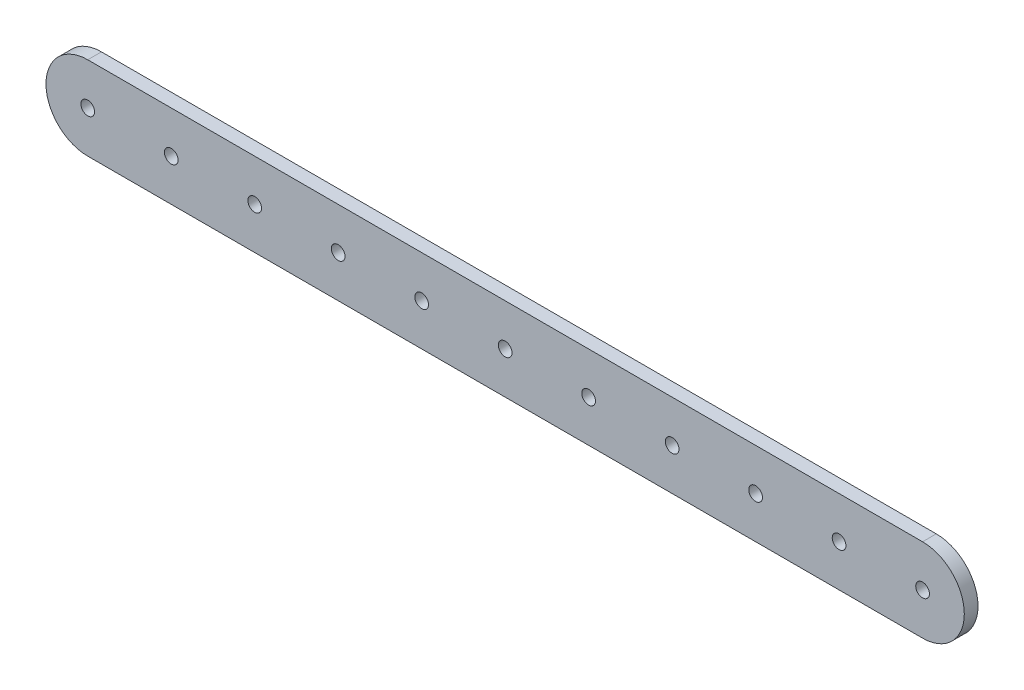
ISO-10303-21;
HEADER;
FILE_DESCRIPTION(('STEP AP214'),'2;1');
FILE_NAME('part.step','',(''),(''),'','','');
FILE_SCHEMA(('AUTOMOTIVE_DESIGN { 1 0 10303 214 1 1 1 1 }'));
ENDSEC;
DATA;
#1=APPLICATION_CONTEXT('core data for automotive mechanical design processes');
#2=APPLICATION_PROTOCOL_DEFINITION('international standard','automotive_design',2000,#1);
#3=PRODUCT_CONTEXT('',#1,'mechanical');
#4=PRODUCT('Part','Part','',(#3));
#5=PRODUCT_RELATED_PRODUCT_CATEGORY('part','',(#4));
#6=PRODUCT_DEFINITION_FORMATION('','',#4);
#7=PRODUCT_DEFINITION_CONTEXT('part definition',#1,'design');
#8=PRODUCT_DEFINITION('design','',#6,#7);
#9=PRODUCT_DEFINITION_SHAPE('','',#8);
#10=(LENGTH_UNIT() NAMED_UNIT(*) SI_UNIT(.MILLI.,.METRE.));
#11=(NAMED_UNIT(*) PLANE_ANGLE_UNIT() SI_UNIT($,.RADIAN.));
#12=(NAMED_UNIT(*) SI_UNIT($,.STERADIAN.) SOLID_ANGLE_UNIT());
#13=UNCERTAINTY_MEASURE_WITH_UNIT(LENGTH_MEASURE(1.E-05),#10,'distance_accuracy_value','');
#14=(GEOMETRIC_REPRESENTATION_CONTEXT(3) GLOBAL_UNCERTAINTY_ASSIGNED_CONTEXT((#13)) GLOBAL_UNIT_ASSIGNED_CONTEXT((#10,
#11,#12)) REPRESENTATION_CONTEXT('',''));
#15=CARTESIAN_POINT('',(0.,0.,0.));
#16=DIRECTION('',(0.,0.,1.));
#17=DIRECTION('',(1.,0.,0.));
#18=AXIS2_PLACEMENT_3D('',#15,#16,#17);
#19=CARTESIAN_POINT('',(-1111.82727272727,0.,-70.7106781186546));
#20=DIRECTION('',(0.,0.,1.));
#21=DIRECTION('',(1.,0.,0.));
#22=AXIS2_PLACEMENT_3D('',#19,#20,#21);
#23=CYLINDRICAL_SURFACE('',#22,25.);
#24=CARTESIAN_POINT('',(-1111.82727272727,0.,0.));
#25=DIRECTION('',(0.,0.,1.));
#26=DIRECTION('',(1.,0.,0.));
#27=AXIS2_PLACEMENT_3D('',#24,#25,#26);
#28=CIRCLE('',#27,25.);
#29=CARTESIAN_POINT('',(-1086.82727272727,0.,0.));
#30=VERTEX_POINT('',#29);
#31=EDGE_CURVE('E50',#30,#30,#28,.F.);
#32=ORIENTED_EDGE('',*,*,#31,.T.);
#33=EDGE_LOOP('',(#32));
#34=FACE_BOUND('',#33,.T.);
#35=CARTESIAN_POINT('',(-1111.82727272727,0.,50.));
#36=DIRECTION('',(0.,0.,1.));
#37=DIRECTION('',(1.,0.,0.));
#38=AXIS2_PLACEMENT_3D('',#35,#36,#37);
#39=CIRCLE('',#38,25.);
#40=CARTESIAN_POINT('',(-1086.82727272727,0.,50.));
#41=VERTEX_POINT('',#40);
#42=EDGE_CURVE('E11',#41,#41,#39,.T.);
#43=ORIENTED_EDGE('',*,*,#42,.T.);
#44=EDGE_LOOP('',(#43));
#45=FACE_BOUND('',#44,.T.);
#46=ADVANCED_FACE('F41',(#34,#45),#23,.F.);
#47=CARTESIAN_POINT('',(-807.027272727272,0.,-70.7106781186546));
#48=DIRECTION('',(0.,0.,1.));
#49=DIRECTION('',(1.,0.,0.));
#50=AXIS2_PLACEMENT_3D('',#47,#48,#49);
#51=CYLINDRICAL_SURFACE('',#50,25.);
#52=CARTESIAN_POINT('',(-807.027272727272,0.,0.));
#53=DIRECTION('',(0.,0.,1.));
#54=DIRECTION('',(1.,0.,0.));
#55=AXIS2_PLACEMENT_3D('',#52,#53,#54);
#56=CIRCLE('',#55,25.);
#57=CARTESIAN_POINT('',(-782.027272727272,0.,0.));
#58=VERTEX_POINT('',#57);
#59=EDGE_CURVE('E179',#58,#58,#56,.F.);
#60=ORIENTED_EDGE('',*,*,#59,.T.);
#61=EDGE_LOOP('',(#60));
#62=FACE_BOUND('',#61,.T.);
#63=CARTESIAN_POINT('',(-807.027272727272,0.,50.));
#64=DIRECTION('',(0.,0.,1.));
#65=DIRECTION('',(1.,0.,0.));
#66=AXIS2_PLACEMENT_3D('',#63,#64,#65);
#67=CIRCLE('',#66,25.);
#68=CARTESIAN_POINT('',(-782.027272727272,0.,50.));
#69=VERTEX_POINT('',#68);
#70=EDGE_CURVE('E183',#69,#69,#67,.T.);
#71=ORIENTED_EDGE('',*,*,#70,.T.);
#72=EDGE_LOOP('',(#71));
#73=FACE_BOUND('',#72,.T.);
#74=ADVANCED_FACE('F211',(#62,#73),#51,.F.);
#75=CARTESIAN_POINT('',(-502.227272727272,0.,-70.7106781186546));
#76=DIRECTION('',(0.,0.,1.));
#77=DIRECTION('',(1.,0.,0.));
#78=AXIS2_PLACEMENT_3D('',#75,#76,#77);
#79=CYLINDRICAL_SURFACE('',#78,25.);
#80=CARTESIAN_POINT('',(-502.227272727272,0.,0.));
#81=DIRECTION('',(0.,0.,1.));
#82=DIRECTION('',(1.,0.,0.));
#83=AXIS2_PLACEMENT_3D('',#80,#81,#82);
#84=CIRCLE('',#83,25.);
#85=CARTESIAN_POINT('',(-477.227272727272,0.,0.));
#86=VERTEX_POINT('',#85);
#87=EDGE_CURVE('E171',#86,#86,#84,.F.);
#88=ORIENTED_EDGE('',*,*,#87,.T.);
#89=EDGE_LOOP('',(#88));
#90=FACE_BOUND('',#89,.T.);
#91=CARTESIAN_POINT('',(-502.227272727272,0.,50.));
#92=DIRECTION('',(0.,0.,1.));
#93=DIRECTION('',(1.,0.,0.));
#94=AXIS2_PLACEMENT_3D('',#91,#92,#93);
#95=CIRCLE('',#94,25.);
#96=CARTESIAN_POINT('',(-477.227272727272,0.,50.));
#97=VERTEX_POINT('',#96);
#98=EDGE_CURVE('E175',#97,#97,#95,.T.);
#99=ORIENTED_EDGE('',*,*,#98,.T.);
#100=EDGE_LOOP('',(#99));
#101=FACE_BOUND('',#100,.T.);
#102=ADVANCED_FACE('F215',(#90,#101),#79,.F.);
#103=CARTESIAN_POINT('',(-197.427272727272,0.,-70.7106781186546));
#104=DIRECTION('',(0.,0.,1.));
#105=DIRECTION('',(1.,0.,0.));
#106=AXIS2_PLACEMENT_3D('',#103,#104,#105);
#107=CYLINDRICAL_SURFACE('',#106,25.);
#108=CARTESIAN_POINT('',(-197.427272727272,0.,0.));
#109=DIRECTION('',(0.,0.,1.));
#110=DIRECTION('',(1.,0.,0.));
#111=AXIS2_PLACEMENT_3D('',#108,#109,#110);
#112=CIRCLE('',#111,25.);
#113=CARTESIAN_POINT('',(-172.427272727272,0.,0.));
#114=VERTEX_POINT('',#113);
#115=EDGE_CURVE('E163',#114,#114,#112,.F.);
#116=ORIENTED_EDGE('',*,*,#115,.T.);
#117=EDGE_LOOP('',(#116));
#118=FACE_BOUND('',#117,.T.);
#119=CARTESIAN_POINT('',(-197.427272727272,0.,50.));
#120=DIRECTION('',(0.,0.,1.));
#121=DIRECTION('',(1.,0.,0.));
#122=AXIS2_PLACEMENT_3D('',#119,#120,#121);
#123=CIRCLE('',#122,25.);
#124=CARTESIAN_POINT('',(-172.427272727272,0.,50.));
#125=VERTEX_POINT('',#124);
#126=EDGE_CURVE('E167',#125,#125,#123,.T.);
#127=ORIENTED_EDGE('',*,*,#126,.T.);
#128=EDGE_LOOP('',(#127));
#129=FACE_BOUND('',#128,.T.);
#130=ADVANCED_FACE('F220',(#118,#129),#107,.F.);
#131=CARTESIAN_POINT('',(107.372727272728,0.,-70.7106781186546));
#132=DIRECTION('',(0.,0.,1.));
#133=DIRECTION('',(1.,0.,0.));
#134=AXIS2_PLACEMENT_3D('',#131,#132,#133);
#135=CYLINDRICAL_SURFACE('',#134,25.);
#136=CARTESIAN_POINT('',(107.372727272728,0.,0.));
#137=DIRECTION('',(0.,0.,1.));
#138=DIRECTION('',(1.,0.,0.));
#139=AXIS2_PLACEMENT_3D('',#136,#137,#138);
#140=CIRCLE('',#139,25.);
#141=CARTESIAN_POINT('',(132.372727272728,0.,0.));
#142=VERTEX_POINT('',#141);
#143=EDGE_CURVE('E155',#142,#142,#140,.F.);
#144=ORIENTED_EDGE('',*,*,#143,.T.);
#145=EDGE_LOOP('',(#144));
#146=FACE_BOUND('',#145,.T.);
#147=CARTESIAN_POINT('',(107.372727272728,0.,50.));
#148=DIRECTION('',(0.,0.,1.));
#149=DIRECTION('',(1.,0.,0.));
#150=AXIS2_PLACEMENT_3D('',#147,#148,#149);
#151=CIRCLE('',#150,25.);
#152=CARTESIAN_POINT('',(132.372727272728,0.,50.));
#153=VERTEX_POINT('',#152);
#154=EDGE_CURVE('E159',#153,#153,#151,.T.);
#155=ORIENTED_EDGE('',*,*,#154,.T.);
#156=EDGE_LOOP('',(#155));
#157=FACE_BOUND('',#156,.T.);
#158=ADVANCED_FACE('F227',(#146,#157),#135,.F.);
#159=CARTESIAN_POINT('',(412.172727272728,0.,-70.7106781186546));
#160=DIRECTION('',(0.,0.,1.));
#161=DIRECTION('',(1.,0.,0.));
#162=AXIS2_PLACEMENT_3D('',#159,#160,#161);
#163=CYLINDRICAL_SURFACE('',#162,25.);
#164=CARTESIAN_POINT('',(412.172727272728,0.,0.));
#165=DIRECTION('',(0.,0.,1.));
#166=DIRECTION('',(1.,0.,0.));
#167=AXIS2_PLACEMENT_3D('',#164,#165,#166);
#168=CIRCLE('',#167,25.);
#169=CARTESIAN_POINT('',(437.172727272728,0.,0.));
#170=VERTEX_POINT('',#169);
#171=EDGE_CURVE('E147',#170,#170,#168,.F.);
#172=ORIENTED_EDGE('',*,*,#171,.T.);
#173=EDGE_LOOP('',(#172));
#174=FACE_BOUND('',#173,.T.);
#175=CARTESIAN_POINT('',(412.172727272728,0.,50.));
#176=DIRECTION('',(0.,0.,1.));
#177=DIRECTION('',(1.,0.,0.));
#178=AXIS2_PLACEMENT_3D('',#175,#176,#177);
#179=CIRCLE('',#178,25.);
#180=CARTESIAN_POINT('',(437.172727272728,0.,50.));
#181=VERTEX_POINT('',#180);
#182=EDGE_CURVE('E151',#181,#181,#179,.T.);
#183=ORIENTED_EDGE('',*,*,#182,.T.);
#184=EDGE_LOOP('',(#183));
#185=FACE_BOUND('',#184,.T.);
#186=ADVANCED_FACE('F231',(#174,#185),#163,.F.);
#187=CARTESIAN_POINT('',(716.972727272728,0.,-70.7106781186546));
#188=DIRECTION('',(0.,0.,1.));
#189=DIRECTION('',(1.,0.,0.));
#190=AXIS2_PLACEMENT_3D('',#187,#188,#189);
#191=CYLINDRICAL_SURFACE('',#190,25.);
#192=CARTESIAN_POINT('',(716.972727272728,0.,0.));
#193=DIRECTION('',(0.,0.,1.));
#194=DIRECTION('',(1.,0.,0.));
#195=AXIS2_PLACEMENT_3D('',#192,#193,#194);
#196=CIRCLE('',#195,25.);
#197=CARTESIAN_POINT('',(741.972727272728,0.,0.));
#198=VERTEX_POINT('',#197);
#199=EDGE_CURVE('E139',#198,#198,#196,.F.);
#200=ORIENTED_EDGE('',*,*,#199,.T.);
#201=EDGE_LOOP('',(#200));
#202=FACE_BOUND('',#201,.T.);
#203=CARTESIAN_POINT('',(716.972727272728,0.,50.));
#204=DIRECTION('',(0.,0.,1.));
#205=DIRECTION('',(1.,0.,0.));
#206=AXIS2_PLACEMENT_3D('',#203,#204,#205);
#207=CIRCLE('',#206,25.);
#208=CARTESIAN_POINT('',(741.972727272728,0.,50.));
#209=VERTEX_POINT('',#208);
#210=EDGE_CURVE('E143',#209,#209,#207,.T.);
#211=ORIENTED_EDGE('',*,*,#210,.T.);
#212=EDGE_LOOP('',(#211));
#213=FACE_BOUND('',#212,.T.);
#214=ADVANCED_FACE('F235',(#202,#213),#191,.F.);
#215=CARTESIAN_POINT('',(1021.77272727273,0.,-70.7106781186546));
#216=DIRECTION('',(0.,0.,1.));
#217=DIRECTION('',(1.,0.,0.));
#218=AXIS2_PLACEMENT_3D('',#215,#216,#217);
#219=CYLINDRICAL_SURFACE('',#218,25.);
#220=CARTESIAN_POINT('',(1021.77272727273,0.,0.));
#221=DIRECTION('',(0.,0.,1.));
#222=DIRECTION('',(1.,0.,0.));
#223=AXIS2_PLACEMENT_3D('',#220,#221,#222);
#224=CIRCLE('',#223,25.);
#225=CARTESIAN_POINT('',(1046.77272727273,0.,0.));
#226=VERTEX_POINT('',#225);
#227=EDGE_CURVE('E131',#226,#226,#224,.F.);
#228=ORIENTED_EDGE('',*,*,#227,.T.);
#229=EDGE_LOOP('',(#228));
#230=FACE_BOUND('',#229,.T.);
#231=CARTESIAN_POINT('',(1021.77272727273,0.,50.));
#232=DIRECTION('',(0.,0.,1.));
#233=DIRECTION('',(1.,0.,0.));
#234=AXIS2_PLACEMENT_3D('',#231,#232,#233);
#235=CIRCLE('',#234,25.);
#236=CARTESIAN_POINT('',(1046.77272727273,0.,50.));
#237=VERTEX_POINT('',#236);
#238=EDGE_CURVE('E135',#237,#237,#235,.T.);
#239=ORIENTED_EDGE('',*,*,#238,.T.);
#240=EDGE_LOOP('',(#239));
#241=FACE_BOUND('',#240,.T.);
#242=ADVANCED_FACE('F239',(#230,#241),#219,.F.);
#243=CARTESIAN_POINT('',(-1416.62727272727,0.,50.));
#244=DIRECTION('',(0.,0.,-1.));
#245=DIRECTION('',(-1.,0.,0.));
#246=AXIS2_PLACEMENT_3D('',#243,#244,#245);
#247=CYLINDRICAL_SURFACE('',#246,152.4);
#248=CARTESIAN_POINT('',(-1416.62727272727,0.,0.));
#249=DIRECTION('',(0.,0.,1.));
#250=DIRECTION('',(1.,0.,0.));
#251=AXIS2_PLACEMENT_3D('',#248,#249,#250);
#252=CIRCLE('',#251,152.4);
#253=CARTESIAN_POINT('',(-1416.62727272727,152.4,0.));
#254=VERTEX_POINT('',#253);
#255=CARTESIAN_POINT('',(-1416.62727272727,-152.4,0.));
#256=VERTEX_POINT('',#255);
#257=EDGE_CURVE('E114',#254,#256,#252,.T.);
#258=ORIENTED_EDGE('',*,*,#257,.T.);
#259=DIRECTION('',(0.,0.,-1.));
#260=VECTOR('',#259,1.);
#261=CARTESIAN_POINT('',(-1416.62727272727,-152.4,50.));
#262=LINE('',#261,#260);
#263=CARTESIAN_POINT('',(-1416.62727272727,-152.4,50.));
#264=VERTEX_POINT('',#263);
#265=EDGE_CURVE('E103',#264,#256,#262,.T.);
#266=ORIENTED_EDGE('',*,*,#265,.F.);
#267=CARTESIAN_POINT('',(-1416.62727272727,0.,50.));
#268=DIRECTION('',(0.,0.,1.));
#269=DIRECTION('',(1.,0.,0.));
#270=AXIS2_PLACEMENT_3D('',#267,#268,#269);
#271=CIRCLE('',#270,152.4);
#272=CARTESIAN_POINT('',(-1416.62727272727,152.4,50.));
#273=VERTEX_POINT('',#272);
#274=EDGE_CURVE('E95',#273,#264,#271,.T.);
#275=ORIENTED_EDGE('',*,*,#274,.F.);
#276=DIRECTION('',(0.,0.,-1.));
#277=VECTOR('',#276,1.);
#278=CARTESIAN_POINT('',(-1416.62727272727,152.4,50.));
#279=LINE('',#278,#277);
#280=EDGE_CURVE('E110',#273,#254,#279,.T.);
#281=ORIENTED_EDGE('',*,*,#280,.T.);
#282=EDGE_LOOP('',(#258,#266,#275,#281));
#283=FACE_BOUND('',#282,.T.);
#284=ADVANCED_FACE('F243',(#283),#247,.T.);
#285=CARTESIAN_POINT('',(-1416.62727272727,-152.4,50.));
#286=DIRECTION('',(0.,1.,0.));
#287=DIRECTION('',(0.,0.,1.));
#288=AXIS2_PLACEMENT_3D('',#285,#286,#287);
#289=PLANE('',#288);
#290=DIRECTION('',(1.,0.,0.));
#291=VECTOR('',#290,1.);
#292=CARTESIAN_POINT('',(-1416.62727272727,-152.4,0.));
#293=LINE('',#292,#291);
#294=CARTESIAN_POINT('',(1631.37272727273,-152.4,0.));
#295=VERTEX_POINT('',#294);
#296=EDGE_CURVE('E101',#256,#295,#293,.T.);
#297=ORIENTED_EDGE('',*,*,#296,.T.);
#298=DIRECTION('',(0.,0.,-1.));
#299=VECTOR('',#298,1.);
#300=CARTESIAN_POINT('',(1631.37272727273,-152.4,50.));
#301=LINE('',#300,#299);
#302=CARTESIAN_POINT('',(1631.37272727273,-152.4,50.));
#303=VERTEX_POINT('',#302);
#304=EDGE_CURVE('E99',#303,#295,#301,.T.);
#305=ORIENTED_EDGE('',*,*,#304,.F.);
#306=DIRECTION('',(1.,0.,0.));
#307=VECTOR('',#306,1.);
#308=CARTESIAN_POINT('',(-1416.62727272727,-152.4,50.));
#309=LINE('',#308,#307);
#310=EDGE_CURVE('E89',#264,#303,#309,.T.);
#311=ORIENTED_EDGE('',*,*,#310,.F.);
#312=ORIENTED_EDGE('',*,*,#265,.T.);
#313=EDGE_LOOP('',(#297,#305,#311,#312));
#314=FACE_BOUND('',#313,.T.);
#315=ADVANCED_FACE('F100',(#314),#289,.F.);
#316=CARTESIAN_POINT('',(1631.37272727273,0.,50.));
#317=DIRECTION('',(0.,0.,-1.));
#318=DIRECTION('',(-1.,0.,0.));
#319=AXIS2_PLACEMENT_3D('',#316,#317,#318);
#320=CYLINDRICAL_SURFACE('',#319,152.4);
#321=CARTESIAN_POINT('',(1631.37272727273,0.,0.));
#322=DIRECTION('',(0.,0.,1.));
#323=DIRECTION('',(1.,0.,0.));
#324=AXIS2_PLACEMENT_3D('',#321,#322,#323);
#325=CIRCLE('',#324,152.4);
#326=CARTESIAN_POINT('',(1631.37272727273,152.4,0.));
#327=VERTEX_POINT('',#326);
#328=EDGE_CURVE('E75',#295,#327,#325,.T.);
#329=ORIENTED_EDGE('',*,*,#328,.T.);
#330=DIRECTION('',(0.,0.,-1.));
#331=VECTOR('',#330,1.);
#332=CARTESIAN_POINT('',(1631.37272727273,152.4,50.));
#333=LINE('',#332,#331);
#334=CARTESIAN_POINT('',(1631.37272727273,152.4,50.));
#335=VERTEX_POINT('',#334);
#336=EDGE_CURVE('E104',#335,#327,#333,.T.);
#337=ORIENTED_EDGE('',*,*,#336,.F.);
#338=CARTESIAN_POINT('',(1631.37272727273,0.,50.));
#339=DIRECTION('',(0.,0.,1.));
#340=DIRECTION('',(1.,0.,0.));
#341=AXIS2_PLACEMENT_3D('',#338,#339,#340);
#342=CIRCLE('',#341,152.4);
#343=EDGE_CURVE('E93',#303,#335,#342,.T.);
#344=ORIENTED_EDGE('',*,*,#343,.F.);
#345=ORIENTED_EDGE('',*,*,#304,.T.);
#346=EDGE_LOOP('',(#329,#337,#344,#345));
#347=FACE_BOUND('',#346,.T.);
#348=ADVANCED_FACE('F106',(#347),#320,.T.);
#349=CARTESIAN_POINT('',(-1416.62727272727,152.4,50.));
#350=DIRECTION('',(0.,-1.,0.));
#351=DIRECTION('',(0.,0.,-1.));
#352=AXIS2_PLACEMENT_3D('',#349,#350,#351);
#353=PLANE('',#352);
#354=DIRECTION('',(-1.,0.,0.));
#355=VECTOR('',#354,1.);
#356=CARTESIAN_POINT('',(-1416.62727272727,152.4,0.));
#357=LINE('',#356,#355);
#358=EDGE_CURVE('E81',#327,#254,#357,.T.);
#359=ORIENTED_EDGE('',*,*,#358,.T.);
#360=ORIENTED_EDGE('',*,*,#280,.F.);
#361=DIRECTION('',(-1.,0.,0.));
#362=VECTOR('',#361,1.);
#363=CARTESIAN_POINT('',(-1416.62727272727,152.4,50.));
#364=LINE('',#363,#362);
#365=EDGE_CURVE('E58',#335,#273,#364,.T.);
#366=ORIENTED_EDGE('',*,*,#365,.F.);
#367=ORIENTED_EDGE('',*,*,#336,.T.);
#368=EDGE_LOOP('',(#359,#360,#366,#367));
#369=FACE_BOUND('',#368,.T.);
#370=ADVANCED_FACE('F204',(#369),#353,.F.);
#371=CARTESIAN_POINT('',(-1416.62727272727,0.,50.));
#372=DIRECTION('',(0.,0.,1.));
#373=DIRECTION('',(1.,0.,0.));
#374=AXIS2_PLACEMENT_3D('',#371,#372,#373);
#375=PLANE('',#374);
#376=CARTESIAN_POINT('',(-1416.62727272727,0.,50.));
#377=DIRECTION('',(0.,0.,1.));
#378=DIRECTION('',(1.,0.,0.));
#379=AXIS2_PLACEMENT_3D('',#376,#377,#378);
#380=CIRCLE('',#379,25.);
#381=CARTESIAN_POINT('',(-1391.62727272727,0.,50.));
#382=VERTEX_POINT('',#381);
#383=EDGE_CURVE('E393',#382,#382,#380,.T.);
#384=ORIENTED_EDGE('',*,*,#383,.F.);
#385=EDGE_LOOP('',(#384));
#386=FACE_BOUND('',#385,.T.);
#387=CARTESIAN_POINT('',(1326.57272727273,0.,50.));
#388=DIRECTION('',(0.,0.,1.));
#389=DIRECTION('',(1.,0.,0.));
#390=AXIS2_PLACEMENT_3D('',#387,#388,#389);
#391=CIRCLE('',#390,25.);
#392=CARTESIAN_POINT('',(1351.57272727273,0.,50.));
#393=VERTEX_POINT('',#392);
#394=EDGE_CURVE('E403',#393,#393,#391,.T.);
#395=ORIENTED_EDGE('',*,*,#394,.F.);
#396=EDGE_LOOP('',(#395));
#397=FACE_BOUND('',#396,.T.);
#398=CARTESIAN_POINT('',(1631.37272727273,0.,50.));
#399=DIRECTION('',(0.,0.,1.));
#400=DIRECTION('',(1.,0.,0.));
#401=AXIS2_PLACEMENT_3D('',#398,#399,#400);
#402=CIRCLE('',#401,25.);
#403=CARTESIAN_POINT('',(1656.37272727273,0.,50.));
#404=VERTEX_POINT('',#403);
#405=EDGE_CURVE('E407',#404,#404,#402,.T.);
#406=ORIENTED_EDGE('',*,*,#405,.F.);
#407=EDGE_LOOP('',(#406));
#408=FACE_BOUND('',#407,.T.);
#409=ORIENTED_EDGE('',*,*,#274,.T.);
#410=ORIENTED_EDGE('',*,*,#310,.T.);
#411=ORIENTED_EDGE('',*,*,#343,.T.);
#412=ORIENTED_EDGE('',*,*,#365,.T.);
#413=EDGE_LOOP('',(#409,#410,#411,#412));
#414=FACE_BOUND('',#413,.T.);
#415=ORIENTED_EDGE('',*,*,#238,.F.);
#416=EDGE_LOOP('',(#415));
#417=FACE_BOUND('',#416,.T.);
#418=ORIENTED_EDGE('',*,*,#210,.F.);
#419=EDGE_LOOP('',(#418));
#420=FACE_BOUND('',#419,.T.);
#421=ORIENTED_EDGE('',*,*,#182,.F.);
#422=EDGE_LOOP('',(#421));
#423=FACE_BOUND('',#422,.T.);
#424=ORIENTED_EDGE('',*,*,#154,.F.);
#425=EDGE_LOOP('',(#424));
#426=FACE_BOUND('',#425,.T.);
#427=ORIENTED_EDGE('',*,*,#126,.F.);
#428=EDGE_LOOP('',(#427));
#429=FACE_BOUND('',#428,.T.);
#430=ORIENTED_EDGE('',*,*,#98,.F.);
#431=EDGE_LOOP('',(#430));
#432=FACE_BOUND('',#431,.T.);
#433=ORIENTED_EDGE('',*,*,#70,.F.);
#434=EDGE_LOOP('',(#433));
#435=FACE_BOUND('',#434,.T.);
#436=ORIENTED_EDGE('',*,*,#42,.F.);
#437=EDGE_LOOP('',(#436));
#438=FACE_BOUND('',#437,.T.);
#439=ADVANCED_FACE('F90',(#386,#397,#408,#414,#417,#420,#423,#426,#429,#432,#435,#438),#375,.T.);
#440=CARTESIAN_POINT('',(-1416.62727272727,0.,0.));
#441=DIRECTION('',(0.,0.,1.));
#442=DIRECTION('',(1.,0.,0.));
#443=AXIS2_PLACEMENT_3D('',#440,#441,#442);
#444=PLANE('',#443);
#445=CARTESIAN_POINT('',(-1416.62727272727,0.,0.));
#446=DIRECTION('',(0.,0.,1.));
#447=DIRECTION('',(1.,0.,0.));
#448=AXIS2_PLACEMENT_3D('',#445,#446,#447);
#449=CIRCLE('',#448,25.);
#450=CARTESIAN_POINT('',(-1391.62727272727,0.,0.));
#451=VERTEX_POINT('',#450);
#452=EDGE_CURVE('E390',#451,#451,#449,.F.);
#453=ORIENTED_EDGE('',*,*,#452,.F.);
#454=EDGE_LOOP('',(#453));
#455=FACE_BOUND('',#454,.T.);
#456=CARTESIAN_POINT('',(1326.57272727273,0.,0.));
#457=DIRECTION('',(0.,0.,1.));
#458=DIRECTION('',(1.,0.,0.));
#459=AXIS2_PLACEMENT_3D('',#456,#457,#458);
#460=CIRCLE('',#459,25.);
#461=CARTESIAN_POINT('',(1351.57272727273,0.,0.));
#462=VERTEX_POINT('',#461);
#463=EDGE_CURVE('E397',#462,#462,#460,.F.);
#464=ORIENTED_EDGE('',*,*,#463,.F.);
#465=EDGE_LOOP('',(#464));
#466=FACE_BOUND('',#465,.T.);
#467=CARTESIAN_POINT('',(1631.37272727273,0.,0.));
#468=DIRECTION('',(0.,0.,1.));
#469=DIRECTION('',(1.,0.,0.));
#470=AXIS2_PLACEMENT_3D('',#467,#468,#469);
#471=CIRCLE('',#470,25.);
#472=CARTESIAN_POINT('',(1656.37272727273,0.,0.));
#473=VERTEX_POINT('',#472);
#474=EDGE_CURVE('E118',#473,#473,#471,.F.);
#475=ORIENTED_EDGE('',*,*,#474,.F.);
#476=EDGE_LOOP('',(#475));
#477=FACE_BOUND('',#476,.T.);
#478=ORIENTED_EDGE('',*,*,#257,.F.);
#479=ORIENTED_EDGE('',*,*,#358,.F.);
#480=ORIENTED_EDGE('',*,*,#328,.F.);
#481=ORIENTED_EDGE('',*,*,#296,.F.);
#482=EDGE_LOOP('',(#478,#479,#480,#481));
#483=FACE_BOUND('',#482,.T.);
#484=ORIENTED_EDGE('',*,*,#227,.F.);
#485=EDGE_LOOP('',(#484));
#486=FACE_BOUND('',#485,.T.);
#487=ORIENTED_EDGE('',*,*,#199,.F.);
#488=EDGE_LOOP('',(#487));
#489=FACE_BOUND('',#488,.T.);
#490=ORIENTED_EDGE('',*,*,#171,.F.);
#491=EDGE_LOOP('',(#490));
#492=FACE_BOUND('',#491,.T.);
#493=ORIENTED_EDGE('',*,*,#143,.F.);
#494=EDGE_LOOP('',(#493));
#495=FACE_BOUND('',#494,.T.);
#496=ORIENTED_EDGE('',*,*,#115,.F.);
#497=EDGE_LOOP('',(#496));
#498=FACE_BOUND('',#497,.T.);
#499=ORIENTED_EDGE('',*,*,#87,.F.);
#500=EDGE_LOOP('',(#499));
#501=FACE_BOUND('',#500,.T.);
#502=ORIENTED_EDGE('',*,*,#59,.F.);
#503=EDGE_LOOP('',(#502));
#504=FACE_BOUND('',#503,.T.);
#505=ORIENTED_EDGE('',*,*,#31,.F.);
#506=EDGE_LOOP('',(#505));
#507=FACE_BOUND('',#506,.T.);
#508=ADVANCED_FACE('F192',(#455,#466,#477,#483,#486,#489,#492,#495,#498,#501,#504,#507),#444,.F.);
#509=CARTESIAN_POINT('',(1631.37272727273,0.,-70.7106781186546));
#510=DIRECTION('',(0.,0.,1.));
#511=DIRECTION('',(1.,0.,0.));
#512=AXIS2_PLACEMENT_3D('',#509,#510,#511);
#513=CYLINDRICAL_SURFACE('',#512,25.);
#514=ORIENTED_EDGE('',*,*,#474,.T.);
#515=EDGE_LOOP('',(#514));
#516=FACE_BOUND('',#515,.T.);
#517=ORIENTED_EDGE('',*,*,#405,.T.);
#518=EDGE_LOOP('',(#517));
#519=FACE_BOUND('',#518,.T.);
#520=ADVANCED_FACE('F194',(#516,#519),#513,.F.);
#521=CARTESIAN_POINT('',(1326.57272727273,0.,-70.7106781186546));
#522=DIRECTION('',(0.,0.,1.));
#523=DIRECTION('',(1.,0.,0.));
#524=AXIS2_PLACEMENT_3D('',#521,#522,#523);
#525=CYLINDRICAL_SURFACE('',#524,25.);
#526=ORIENTED_EDGE('',*,*,#463,.T.);
#527=EDGE_LOOP('',(#526));
#528=FACE_BOUND('',#527,.T.);
#529=ORIENTED_EDGE('',*,*,#394,.T.);
#530=EDGE_LOOP('',(#529));
#531=FACE_BOUND('',#530,.T.);
#532=ADVANCED_FACE('F201',(#528,#531),#525,.F.);
#533=CARTESIAN_POINT('',(-1416.62727272727,0.,-70.7106781186546));
#534=DIRECTION('',(0.,0.,1.));
#535=DIRECTION('',(1.,0.,0.));
#536=AXIS2_PLACEMENT_3D('',#533,#534,#535);
#537=CYLINDRICAL_SURFACE('',#536,25.);
#538=ORIENTED_EDGE('',*,*,#452,.T.);
#539=EDGE_LOOP('',(#538));
#540=FACE_BOUND('',#539,.T.);
#541=ORIENTED_EDGE('',*,*,#383,.T.);
#542=EDGE_LOOP('',(#541));
#543=FACE_BOUND('',#542,.T.);
#544=ADVANCED_FACE('F281',(#540,#543),#537,.F.);
#545=CLOSED_SHELL('',(#46,#74,#102,#130,#158,#186,#214,#242,#284,#315,#348,#370,#439,#508,#520,
#532,#544));
#546=MANIFOLD_SOLID_BREP('B2',#545);
#547=ADVANCED_BREP_SHAPE_REPRESENTATION('',(#18,#546),#14);
#548=SHAPE_DEFINITION_REPRESENTATION(#9,#547);
ENDSEC;
END-ISO-10303-21;
